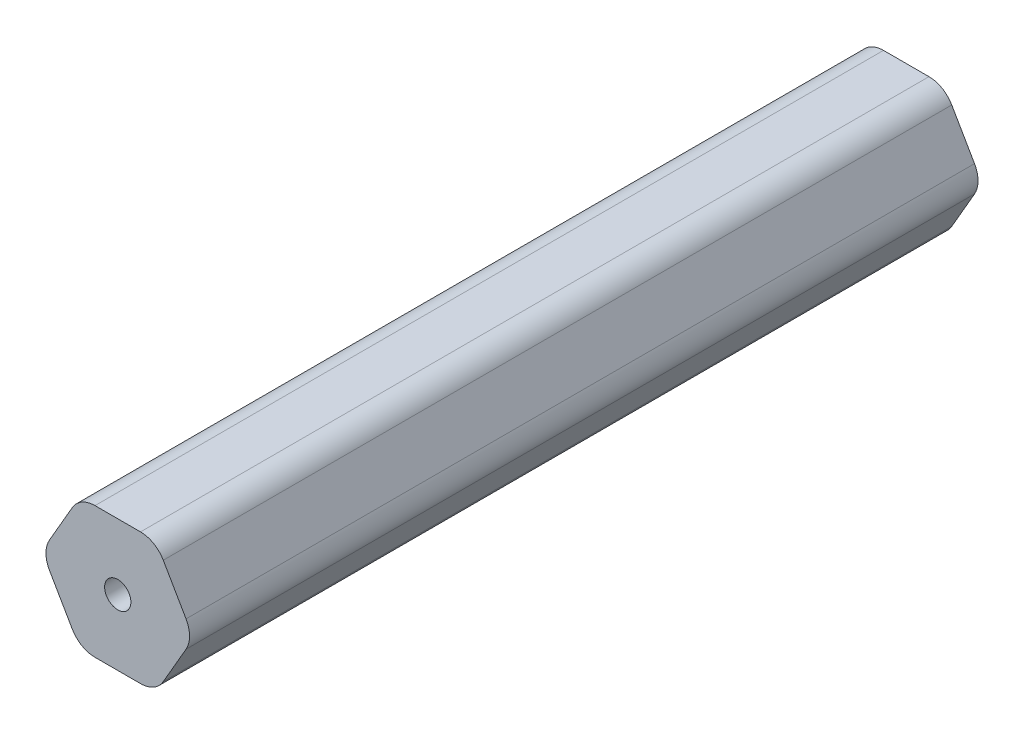
ISO-10303-21;
HEADER;
FILE_DESCRIPTION(('STEP AP214'),'2;1');
FILE_NAME('part.step','',(''),(''),'','','');
FILE_SCHEMA(('AUTOMOTIVE_DESIGN { 1 0 10303 214 1 1 1 1 }'));
ENDSEC;
DATA;
#1=APPLICATION_CONTEXT('core data for automotive mechanical design processes');
#2=APPLICATION_PROTOCOL_DEFINITION('international standard','automotive_design',2000,#1);
#3=PRODUCT_CONTEXT('',#1,'mechanical');
#4=PRODUCT('Part','Part','',(#3));
#5=PRODUCT_RELATED_PRODUCT_CATEGORY('part','',(#4));
#6=PRODUCT_DEFINITION_FORMATION('','',#4);
#7=PRODUCT_DEFINITION_CONTEXT('part definition',#1,'design');
#8=PRODUCT_DEFINITION('design','',#6,#7);
#9=PRODUCT_DEFINITION_SHAPE('','',#8);
#10=(LENGTH_UNIT() NAMED_UNIT(*) SI_UNIT(.MILLI.,.METRE.));
#11=(NAMED_UNIT(*) PLANE_ANGLE_UNIT() SI_UNIT($,.RADIAN.));
#12=(NAMED_UNIT(*) SI_UNIT($,.STERADIAN.) SOLID_ANGLE_UNIT());
#13=UNCERTAINTY_MEASURE_WITH_UNIT(LENGTH_MEASURE(1.E-05),#10,'distance_accuracy_value','');
#14=(GEOMETRIC_REPRESENTATION_CONTEXT(3) GLOBAL_UNCERTAINTY_ASSIGNED_CONTEXT((#13)) GLOBAL_UNIT_ASSIGNED_CONTEXT((#10,
#11,#12)) REPRESENTATION_CONTEXT('',''));
#15=CARTESIAN_POINT('',(0.,0.,0.));
#16=DIRECTION('',(0.,0.,1.));
#17=DIRECTION('',(1.,0.,0.));
#18=AXIS2_PLACEMENT_3D('',#15,#16,#17);
#19=CARTESIAN_POINT('',(0.,0.,76.2));
#20=DIRECTION('',(0.,0.,1.));
#21=DIRECTION('',(1.,0.,0.));
#22=AXIS2_PLACEMENT_3D('',#19,#20,#21);
#23=PLANE('',#22);
#24=DIRECTION('',(0.500000000000007,-0.866025403784434,0.));
#25=VECTOR('',#24,1.);
#26=CARTESIAN_POINT('',(-13.8020676116861,-0.934514994541311,76.2));
#27=LINE('',#26,#25);
#28=CARTESIAN_POINT('',(-13.0688327698153,-2.20451499454131,76.2));
#29=VERTEX_POINT('',#28);
#30=CARTESIAN_POINT('',(-10.8691282442028,-6.0145149945413,76.2));
#31=VERTEX_POINT('',#30);
#32=EDGE_CURVE('E262',#29,#31,#27,.T.);
#33=ORIENTED_EDGE('',*,*,#32,.T.);
#34=CARTESIAN_POINT('',(-8.6694237185903,-4.74451499454128,76.2));
#35=DIRECTION('',(0.,0.,1.));
#36=DIRECTION('',(1.,0.,0.));
#37=AXIS2_PLACEMENT_3D('',#34,#35,#36);
#38=CIRCLE('',#37,2.54);
#39=CARTESIAN_POINT('',(-8.66942371859028,-7.28451499454128,76.2));
#40=VERTEX_POINT('',#39);
#41=EDGE_CURVE('E210',#31,#40,#38,.T.);
#42=ORIENTED_EDGE('',*,*,#41,.T.);
#43=DIRECTION('',(1.,0.,0.));
#44=VECTOR('',#43,1.);
#45=CARTESIAN_POINT('',(-10.1358934023319,-7.2845149945413,76.2));
#46=LINE('',#45,#44);
#47=CARTESIAN_POINT('',(-4.2700146673653,-7.28451499454124,76.2));
#48=VERTEX_POINT('',#47);
#49=EDGE_CURVE('E155',#40,#48,#46,.T.);
#50=ORIENTED_EDGE('',*,*,#49,.T.);
#51=CARTESIAN_POINT('',(-4.27001466736533,-4.74451499454124,76.2));
#52=DIRECTION('',(0.,0.,1.));
#53=DIRECTION('',(1.,0.,0.));
#54=AXIS2_PLACEMENT_3D('',#51,#52,#53);
#55=CIRCLE('',#54,2.54);
#56=CARTESIAN_POINT('',(-2.07031014175285,-6.01451499454122,76.2));
#57=VERTEX_POINT('',#56);
#58=EDGE_CURVE('E207',#48,#57,#55,.T.);
#59=ORIENTED_EDGE('',*,*,#58,.T.);
#60=DIRECTION('',(0.499999999999995,0.866025403784441,0.));
#61=VECTOR('',#60,1.);
#62=CARTESIAN_POINT('',(-2.80354498362366,-7.28451499454122,76.2));
#63=LINE('',#62,#61);
#64=CARTESIAN_POINT('',(0.129394383859577,-2.20451499454126,76.2));
#65=VERTEX_POINT('',#64);
#66=EDGE_CURVE('E164',#57,#65,#63,.T.);
#67=ORIENTED_EDGE('',*,*,#66,.T.);
#68=CARTESIAN_POINT('',(-2.0703101417529,-0.934514994541271,76.2));
#69=DIRECTION('',(0.,0.,1.));
#70=DIRECTION('',(1.,0.,0.));
#71=AXIS2_PLACEMENT_3D('',#68,#69,#70);
#72=CIRCLE('',#71,2.54);
#73=CARTESIAN_POINT('',(0.129394383859569,0.335485005458732,76.2));
#74=VERTEX_POINT('',#73);
#75=EDGE_CURVE('E204',#65,#74,#72,.T.);
#76=ORIENTED_EDGE('',*,*,#75,.T.);
#77=DIRECTION('',(-0.500000000000001,0.866025403784438,0.));
#78=VECTOR('',#77,1.);
#79=CARTESIAN_POINT('',(0.862629225730391,-0.93451499454126,76.2));
#80=LINE('',#79,#78);
#81=CARTESIAN_POINT('',(-2.07031014175292,4.14548500545875,76.2));
#82=VERTEX_POINT('',#81);
#83=EDGE_CURVE('E170',#74,#82,#80,.T.);
#84=ORIENTED_EDGE('',*,*,#83,.T.);
#85=CARTESIAN_POINT('',(-4.27001466736539,2.87548500545875,76.2));
#86=DIRECTION('',(0.,0.,1.));
#87=DIRECTION('',(1.,0.,0.));
#88=AXIS2_PLACEMENT_3D('',#85,#86,#87);
#89=CIRCLE('',#88,2.54);
#90=CARTESIAN_POINT('',(-4.2700146673654,5.41548500545875,76.2));
#91=VERTEX_POINT('',#90);
#92=EDGE_CURVE('E196',#82,#91,#89,.T.);
#93=ORIENTED_EDGE('',*,*,#92,.T.);
#94=DIRECTION('',(-1.,0.,0.));
#95=VECTOR('',#94,1.);
#96=CARTESIAN_POINT('',(-2.80354498362375,5.41548500545875,76.2));
#97=LINE('',#96,#95);
#98=CARTESIAN_POINT('',(-8.66942371859036,5.41548500545873,76.2));
#99=VERTEX_POINT('',#98);
#100=EDGE_CURVE('E242',#91,#99,#97,.T.);
#101=ORIENTED_EDGE('',*,*,#100,.T.);
#102=CARTESIAN_POINT('',(-8.66942371859035,2.87548500545873,76.2));
#103=DIRECTION('',(0.,0.,1.));
#104=DIRECTION('',(1.,0.,0.));
#105=AXIS2_PLACEMENT_3D('',#102,#103,#104);
#106=CIRCLE('',#105,2.54);
#107=CARTESIAN_POINT('',(-10.8691282442028,4.14548500545872,76.2));
#108=VERTEX_POINT('',#107);
#109=EDGE_CURVE('E66',#99,#108,#106,.T.);
#110=ORIENTED_EDGE('',*,*,#109,.T.);
#111=DIRECTION('',(-0.499999999999995,-0.866025403784441,0.));
#112=VECTOR('',#111,1.);
#113=CARTESIAN_POINT('',(-10.135893402332,5.41548500545873,76.2));
#114=LINE('',#113,#112);
#115=CARTESIAN_POINT('',(-13.0688327698153,0.335485005458698,76.2));
#116=VERTEX_POINT('',#115);
#117=EDGE_CURVE('E266',#108,#116,#114,.T.);
#118=ORIENTED_EDGE('',*,*,#117,.T.);
#119=CARTESIAN_POINT('',(-10.8691282442028,-0.93451499454129,76.2));
#120=DIRECTION('',(0.,0.,1.));
#121=DIRECTION('',(1.,0.,0.));
#122=AXIS2_PLACEMENT_3D('',#119,#120,#121);
#123=CIRCLE('',#122,2.54);
#124=EDGE_CURVE('E201',#116,#29,#123,.T.);
#125=ORIENTED_EDGE('',*,*,#124,.T.);
#126=EDGE_LOOP('',(#33,#42,#50,#59,#67,#76,#84,#93,#101,#110,#118,#125));
#127=FACE_BOUND('',#126,.T.);
#128=CARTESIAN_POINT('',(-6.46971919297786,-0.93451499454126,76.2));
#129=DIRECTION('',(0.,0.,1.));
#130=DIRECTION('',(1.,0.,0.));
#131=AXIS2_PLACEMENT_3D('',#128,#129,#130);
#132=CIRCLE('',#131,1.27);
#133=CARTESIAN_POINT('',(-7.73971919297786,-0.93451499454126,76.2));
#134=VERTEX_POINT('',#133);
#135=EDGE_CURVE('E259',#134,#134,#132,.T.);
#136=ORIENTED_EDGE('',*,*,#135,.F.);
#137=EDGE_LOOP('',(#136));
#138=FACE_BOUND('',#137,.T.);
#139=ADVANCED_FACE('F43',(#127,#138),#23,.T.);
#140=CARTESIAN_POINT('',(0.,0.,0.));
#141=DIRECTION('',(0.,0.,1.));
#142=DIRECTION('',(1.,0.,0.));
#143=AXIS2_PLACEMENT_3D('',#140,#141,#142);
#144=PLANE('',#143);
#145=DIRECTION('',(1.,0.,0.));
#146=VECTOR('',#145,1.);
#147=CARTESIAN_POINT('',(-10.1358934023319,-7.2845149945413,0.));
#148=LINE('',#147,#146);
#149=CARTESIAN_POINT('',(-8.66942371859028,-7.28451499454128,0.));
#150=VERTEX_POINT('',#149);
#151=CARTESIAN_POINT('',(-4.2700146673653,-7.28451499454124,0.));
#152=VERTEX_POINT('',#151);
#153=EDGE_CURVE('E152',#150,#152,#148,.T.);
#154=ORIENTED_EDGE('',*,*,#153,.F.);
#155=CARTESIAN_POINT('',(-8.6694237185903,-4.74451499454128,0.));
#156=DIRECTION('',(0.,0.,1.));
#157=DIRECTION('',(1.,0.,0.));
#158=AXIS2_PLACEMENT_3D('',#155,#156,#157);
#159=CIRCLE('',#158,2.54);
#160=CARTESIAN_POINT('',(-10.8691282442028,-6.0145149945413,0.));
#161=VERTEX_POINT('',#160);
#162=EDGE_CURVE('E134',#150,#161,#159,.F.);
#163=ORIENTED_EDGE('',*,*,#162,.T.);
#164=DIRECTION('',(0.500000000000007,-0.866025403784434,0.));
#165=VECTOR('',#164,1.);
#166=CARTESIAN_POINT('',(-13.8020676116861,-0.934514994541311,0.));
#167=LINE('',#166,#165);
#168=CARTESIAN_POINT('',(-13.0688327698153,-2.20451499454131,0.));
#169=VERTEX_POINT('',#168);
#170=EDGE_CURVE('E165',#169,#161,#167,.T.);
#171=ORIENTED_EDGE('',*,*,#170,.F.);
#172=CARTESIAN_POINT('',(-10.8691282442028,-0.93451499454129,0.));
#173=DIRECTION('',(0.,0.,1.));
#174=DIRECTION('',(1.,0.,0.));
#175=AXIS2_PLACEMENT_3D('',#172,#173,#174);
#176=CIRCLE('',#175,2.54);
#177=CARTESIAN_POINT('',(-13.0688327698153,0.335485005458698,0.));
#178=VERTEX_POINT('',#177);
#179=EDGE_CURVE('E183',#169,#178,#176,.F.);
#180=ORIENTED_EDGE('',*,*,#179,.T.);
#181=DIRECTION('',(-0.499999999999995,-0.866025403784441,0.));
#182=VECTOR('',#181,1.);
#183=CARTESIAN_POINT('',(-10.135893402332,5.41548500545873,0.));
#184=LINE('',#183,#182);
#185=CARTESIAN_POINT('',(-10.8691282442028,4.14548500545872,0.));
#186=VERTEX_POINT('',#185);
#187=EDGE_CURVE('E172',#186,#178,#184,.T.);
#188=ORIENTED_EDGE('',*,*,#187,.F.);
#189=CARTESIAN_POINT('',(-8.66942371859035,2.87548500545873,0.));
#190=DIRECTION('',(0.,0.,1.));
#191=DIRECTION('',(1.,0.,0.));
#192=AXIS2_PLACEMENT_3D('',#189,#190,#191);
#193=CIRCLE('',#192,2.54);
#194=CARTESIAN_POINT('',(-8.66942371859036,5.41548500545873,0.));
#195=VERTEX_POINT('',#194);
#196=EDGE_CURVE('E180',#186,#195,#193,.F.);
#197=ORIENTED_EDGE('',*,*,#196,.T.);
#198=DIRECTION('',(-1.,0.,0.));
#199=VECTOR('',#198,1.);
#200=CARTESIAN_POINT('',(-2.80354498362375,5.41548500545875,0.));
#201=LINE('',#200,#199);
#202=CARTESIAN_POINT('',(-4.2700146673654,5.41548500545875,0.));
#203=VERTEX_POINT('',#202);
#204=EDGE_CURVE('E240',#203,#195,#201,.T.);
#205=ORIENTED_EDGE('',*,*,#204,.F.);
#206=CARTESIAN_POINT('',(-4.27001466736539,2.87548500545875,0.));
#207=DIRECTION('',(0.,0.,1.));
#208=DIRECTION('',(1.,0.,0.));
#209=AXIS2_PLACEMENT_3D('',#206,#207,#208);
#210=CIRCLE('',#209,2.54);
#211=CARTESIAN_POINT('',(-2.07031014175292,4.14548500545875,0.));
#212=VERTEX_POINT('',#211);
#213=EDGE_CURVE('E157',#203,#212,#210,.F.);
#214=ORIENTED_EDGE('',*,*,#213,.T.);
#215=DIRECTION('',(-0.500000000000001,0.866025403784438,0.));
#216=VECTOR('',#215,1.);
#217=CARTESIAN_POINT('',(0.862629225730391,-0.93451499454126,0.));
#218=LINE('',#217,#216);
#219=CARTESIAN_POINT('',(0.129394383859569,0.335485005458732,0.));
#220=VERTEX_POINT('',#219);
#221=EDGE_CURVE('E249',#220,#212,#218,.T.);
#222=ORIENTED_EDGE('',*,*,#221,.F.);
#223=CARTESIAN_POINT('',(-2.0703101417529,-0.934514994541271,0.));
#224=DIRECTION('',(0.,0.,1.));
#225=DIRECTION('',(1.,0.,0.));
#226=AXIS2_PLACEMENT_3D('',#223,#224,#225);
#227=CIRCLE('',#226,2.54);
#228=CARTESIAN_POINT('',(0.129394383859577,-2.20451499454126,0.));
#229=VERTEX_POINT('',#228);
#230=EDGE_CURVE('E186',#220,#229,#227,.F.);
#231=ORIENTED_EDGE('',*,*,#230,.T.);
#232=DIRECTION('',(0.499999999999995,0.866025403784441,0.));
#233=VECTOR('',#232,1.);
#234=CARTESIAN_POINT('',(-2.80354498362366,-7.28451499454122,0.));
#235=LINE('',#234,#233);
#236=CARTESIAN_POINT('',(-2.07031014175285,-6.01451499454122,0.));
#237=VERTEX_POINT('',#236);
#238=EDGE_CURVE('E253',#237,#229,#235,.T.);
#239=ORIENTED_EDGE('',*,*,#238,.F.);
#240=CARTESIAN_POINT('',(-4.27001466736533,-4.74451499454124,0.));
#241=DIRECTION('',(0.,0.,1.));
#242=DIRECTION('',(1.,0.,0.));
#243=AXIS2_PLACEMENT_3D('',#240,#241,#242);
#244=CIRCLE('',#243,2.54);
#245=EDGE_CURVE('E146',#237,#152,#244,.F.);
#246=ORIENTED_EDGE('',*,*,#245,.T.);
#247=EDGE_LOOP('',(#154,#163,#171,#180,#188,#197,#205,#214,#222,#231,#239,#246));
#248=FACE_BOUND('',#247,.T.);
#249=CARTESIAN_POINT('',(-6.46971919297786,-0.93451499454126,0.));
#250=DIRECTION('',(0.,0.,1.));
#251=DIRECTION('',(1.,0.,0.));
#252=AXIS2_PLACEMENT_3D('',#249,#250,#251);
#253=CIRCLE('',#252,1.27);
#254=CARTESIAN_POINT('',(-7.73971919297786,-0.93451499454126,0.));
#255=VERTEX_POINT('',#254);
#256=EDGE_CURVE('E274',#255,#255,#253,.T.);
#257=ORIENTED_EDGE('',*,*,#256,.T.);
#258=EDGE_LOOP('',(#257));
#259=FACE_BOUND('',#258,.T.);
#260=ADVANCED_FACE('F160',(#248,#259),#144,.F.);
#261=CARTESIAN_POINT('',(-2.80354498362366,-7.28451499454122,76.2));
#262=DIRECTION('',(-0.866025403784442,0.499999999999995,0.));
#263=DIRECTION('',(-0.499999999999995,-0.866025403784442,0.));
#264=AXIS2_PLACEMENT_3D('',#261,#262,#263);
#265=PLANE('',#264);
#266=ORIENTED_EDGE('',*,*,#66,.F.);
#267=DIRECTION('',(0.,0.,-1.));
#268=VECTOR('',#267,1.);
#269=CARTESIAN_POINT('',(-2.07031014175285,-6.01451499454122,76.2));
#270=LINE('',#269,#268);
#271=EDGE_CURVE('E216',#57,#237,#270,.T.);
#272=ORIENTED_EDGE('',*,*,#271,.T.);
#273=ORIENTED_EDGE('',*,*,#238,.T.);
#274=DIRECTION('',(0.,0.,-1.));
#275=VECTOR('',#274,1.);
#276=CARTESIAN_POINT('',(0.129394383859577,-2.20451499454126,76.2));
#277=LINE('',#276,#275);
#278=EDGE_CURVE('E213',#229,#65,#277,.F.);
#279=ORIENTED_EDGE('',*,*,#278,.T.);
#280=EDGE_LOOP('',(#266,#272,#273,#279));
#281=FACE_BOUND('',#280,.T.);
#282=ADVANCED_FACE('F290',(#281),#265,.F.);
#283=CARTESIAN_POINT('',(0.862629225730391,-0.93451499454126,76.2));
#284=DIRECTION('',(-0.866025403784438,-0.500000000000001,0.));
#285=DIRECTION('',(0.500000000000001,-0.866025403784438,0.));
#286=AXIS2_PLACEMENT_3D('',#283,#284,#285);
#287=PLANE('',#286);
#288=ORIENTED_EDGE('',*,*,#83,.F.);
#289=DIRECTION('',(0.,0.,-1.));
#290=VECTOR('',#289,1.);
#291=CARTESIAN_POINT('',(0.129394383859569,0.335485005458732,76.2));
#292=LINE('',#291,#290);
#293=EDGE_CURVE('E223',#74,#220,#292,.T.);
#294=ORIENTED_EDGE('',*,*,#293,.T.);
#295=ORIENTED_EDGE('',*,*,#221,.T.);
#296=DIRECTION('',(0.,0.,-1.));
#297=VECTOR('',#296,1.);
#298=CARTESIAN_POINT('',(-2.07031014175292,4.14548500545875,76.2));
#299=LINE('',#298,#297);
#300=EDGE_CURVE('E220',#212,#82,#299,.F.);
#301=ORIENTED_EDGE('',*,*,#300,.T.);
#302=EDGE_LOOP('',(#288,#294,#295,#301));
#303=FACE_BOUND('',#302,.T.);
#304=ADVANCED_FACE('F305',(#303),#287,.F.);
#305=CARTESIAN_POINT('',(-2.80354498362375,5.41548500545875,76.2));
#306=DIRECTION('',(0.,-1.,0.));
#307=DIRECTION('',(1.,0.,0.));
#308=AXIS2_PLACEMENT_3D('',#305,#306,#307);
#309=PLANE('',#308);
#310=ORIENTED_EDGE('',*,*,#204,.T.);
#311=DIRECTION('',(0.,0.,-1.));
#312=VECTOR('',#311,1.);
#313=CARTESIAN_POINT('',(-8.66942371859036,5.41548500545873,76.2));
#314=LINE('',#313,#312);
#315=EDGE_CURVE('E11',#195,#99,#314,.F.);
#316=ORIENTED_EDGE('',*,*,#315,.T.);
#317=ORIENTED_EDGE('',*,*,#100,.F.);
#318=DIRECTION('',(0.,0.,-1.));
#319=VECTOR('',#318,1.);
#320=CARTESIAN_POINT('',(-4.2700146673654,5.41548500545875,76.2));
#321=LINE('',#320,#319);
#322=EDGE_CURVE('E52',#91,#203,#321,.T.);
#323=ORIENTED_EDGE('',*,*,#322,.T.);
#324=EDGE_LOOP('',(#310,#316,#317,#323));
#325=FACE_BOUND('',#324,.T.);
#326=ADVANCED_FACE('F239',(#325),#309,.F.);
#327=CARTESIAN_POINT('',(-10.135893402332,5.41548500545873,76.2));
#328=DIRECTION('',(0.866025403784442,-0.499999999999995,0.));
#329=DIRECTION('',(0.499999999999995,0.866025403784442,0.));
#330=AXIS2_PLACEMENT_3D('',#327,#328,#329);
#331=PLANE('',#330);
#332=ORIENTED_EDGE('',*,*,#187,.T.);
#333=DIRECTION('',(0.,0.,-1.));
#334=VECTOR('',#333,1.);
#335=CARTESIAN_POINT('',(-13.0688327698153,0.335485005458698,76.2));
#336=LINE('',#335,#334);
#337=EDGE_CURVE('E59',#178,#116,#336,.F.);
#338=ORIENTED_EDGE('',*,*,#337,.T.);
#339=ORIENTED_EDGE('',*,*,#117,.F.);
#340=DIRECTION('',(0.,0.,-1.));
#341=VECTOR('',#340,1.);
#342=CARTESIAN_POINT('',(-10.8691282442028,4.14548500545872,76.2));
#343=LINE('',#342,#341);
#344=EDGE_CURVE('E227',#108,#186,#343,.T.);
#345=ORIENTED_EDGE('',*,*,#344,.T.);
#346=EDGE_LOOP('',(#332,#338,#339,#345));
#347=FACE_BOUND('',#346,.T.);
#348=ADVANCED_FACE('F299',(#347),#331,.F.);
#349=CARTESIAN_POINT('',(-13.8020676116861,-0.934514994541311,76.2));
#350=DIRECTION('',(0.866025403784434,0.500000000000007,0.));
#351=DIRECTION('',(-0.500000000000007,0.866025403784434,0.));
#352=AXIS2_PLACEMENT_3D('',#349,#350,#351);
#353=PLANE('',#352);
#354=ORIENTED_EDGE('',*,*,#170,.T.);
#355=DIRECTION('',(0.,0.,-1.));
#356=VECTOR('',#355,1.);
#357=CARTESIAN_POINT('',(-10.8691282442028,-6.0145149945413,76.2));
#358=LINE('',#357,#356);
#359=EDGE_CURVE('E139',#161,#31,#358,.F.);
#360=ORIENTED_EDGE('',*,*,#359,.T.);
#361=ORIENTED_EDGE('',*,*,#32,.F.);
#362=DIRECTION('',(0.,0.,-1.));
#363=VECTOR('',#362,1.);
#364=CARTESIAN_POINT('',(-13.0688327698153,-2.20451499454131,76.2));
#365=LINE('',#364,#363);
#366=EDGE_CURVE('E145',#29,#169,#365,.T.);
#367=ORIENTED_EDGE('',*,*,#366,.T.);
#368=EDGE_LOOP('',(#354,#360,#361,#367));
#369=FACE_BOUND('',#368,.T.);
#370=ADVANCED_FACE('F296',(#369),#353,.F.);
#371=CARTESIAN_POINT('',(-10.1358934023319,-7.2845149945413,76.2));
#372=DIRECTION('',(0.,1.,0.));
#373=DIRECTION('',(-1.,0.,0.));
#374=AXIS2_PLACEMENT_3D('',#371,#372,#373);
#375=PLANE('',#374);
#376=ORIENTED_EDGE('',*,*,#49,.F.);
#377=DIRECTION('',(0.,0.,-1.));
#378=VECTOR('',#377,1.);
#379=CARTESIAN_POINT('',(-8.66942371859028,-7.28451499454128,76.2));
#380=LINE('',#379,#378);
#381=EDGE_CURVE('E138',#40,#150,#380,.T.);
#382=ORIENTED_EDGE('',*,*,#381,.T.);
#383=ORIENTED_EDGE('',*,*,#153,.T.);
#384=DIRECTION('',(0.,0.,-1.));
#385=VECTOR('',#384,1.);
#386=CARTESIAN_POINT('',(-4.2700146673653,-7.28451499454124,76.2));
#387=LINE('',#386,#385);
#388=EDGE_CURVE('E158',#152,#48,#387,.F.);
#389=ORIENTED_EDGE('',*,*,#388,.T.);
#390=EDGE_LOOP('',(#376,#382,#383,#389));
#391=FACE_BOUND('',#390,.T.);
#392=ADVANCED_FACE('F151',(#391),#375,.F.);
#393=CARTESIAN_POINT('',(-6.46971919297786,-0.93451499454126,76.2));
#394=DIRECTION('',(0.,0.,-1.));
#395=DIRECTION('',(-1.,0.,0.));
#396=AXIS2_PLACEMENT_3D('',#393,#394,#395);
#397=CYLINDRICAL_SURFACE('',#396,1.27);
#398=CARTESIAN_POINT('',(-7.73971919297786,-0.93451499454126,76.2));
#399=CARTESIAN_POINT('',(-7.73971919297786,-0.93451499454126,75.40625));
#400=CARTESIAN_POINT('',(-7.73971919297786,-0.93451499454126,74.6125));
#401=CARTESIAN_POINT('',(-7.73971919297786,-0.93451499454126,73.025));
#402=CARTESIAN_POINT('',(-7.73971919297786,-0.93451499454126,72.23125));
#403=CARTESIAN_POINT('',(-7.73971919297786,-0.93451499454126,70.64375));
#404=CARTESIAN_POINT('',(-7.73971919297786,-0.93451499454126,69.85));
#405=CARTESIAN_POINT('',(-7.73971919297786,-0.93451499454126,68.2625));
#406=CARTESIAN_POINT('',(-7.73971919297786,-0.93451499454126,67.46875));
#407=CARTESIAN_POINT('',(-7.73971919297786,-0.93451499454126,65.88125));
#408=CARTESIAN_POINT('',(-7.73971919297786,-0.93451499454126,65.0875));
#409=CARTESIAN_POINT('',(-7.73971919297786,-0.93451499454126,63.5));
#410=CARTESIAN_POINT('',(-7.73971919297786,-0.93451499454126,62.70625));
#411=CARTESIAN_POINT('',(-7.73971919297786,-0.93451499454126,61.11875));
#412=CARTESIAN_POINT('',(-7.73971919297786,-0.93451499454126,60.325));
#413=CARTESIAN_POINT('',(-7.73971919297786,-0.93451499454126,58.7375));
#414=CARTESIAN_POINT('',(-7.73971919297786,-0.93451499454126,57.94375));
#415=CARTESIAN_POINT('',(-7.73971919297786,-0.93451499454126,56.35625));
#416=CARTESIAN_POINT('',(-7.73971919297786,-0.93451499454126,55.5625));
#417=CARTESIAN_POINT('',(-7.73971919297786,-0.93451499454126,53.975));
#418=CARTESIAN_POINT('',(-7.73971919297786,-0.93451499454126,53.18125));
#419=CARTESIAN_POINT('',(-7.73971919297786,-0.93451499454126,51.59375));
#420=CARTESIAN_POINT('',(-7.73971919297786,-0.93451499454126,50.8));
#421=CARTESIAN_POINT('',(-7.73971919297786,-0.93451499454126,49.2125));
#422=CARTESIAN_POINT('',(-7.73971919297786,-0.93451499454126,48.41875));
#423=CARTESIAN_POINT('',(-7.73971919297786,-0.93451499454126,46.83125));
#424=CARTESIAN_POINT('',(-7.73971919297786,-0.93451499454126,46.0375));
#425=CARTESIAN_POINT('',(-7.73971919297786,-0.93451499454126,44.45));
#426=CARTESIAN_POINT('',(-7.73971919297786,-0.93451499454126,43.65625));
#427=CARTESIAN_POINT('',(-7.73971919297786,-0.93451499454126,42.06875));
#428=CARTESIAN_POINT('',(-7.73971919297786,-0.93451499454126,41.275));
#429=CARTESIAN_POINT('',(-7.73971919297786,-0.93451499454126,39.6875));
#430=CARTESIAN_POINT('',(-7.73971919297786,-0.93451499454126,38.89375));
#431=CARTESIAN_POINT('',(-7.73971919297786,-0.93451499454126,37.30625));
#432=CARTESIAN_POINT('',(-7.73971919297786,-0.93451499454126,36.5125));
#433=CARTESIAN_POINT('',(-7.73971919297786,-0.93451499454126,34.925));
#434=CARTESIAN_POINT('',(-7.73971919297786,-0.93451499454126,34.13125));
#435=CARTESIAN_POINT('',(-7.73971919297786,-0.93451499454126,32.54375));
#436=CARTESIAN_POINT('',(-7.73971919297786,-0.93451499454126,31.75));
#437=CARTESIAN_POINT('',(-7.73971919297786,-0.93451499454126,30.1625));
#438=CARTESIAN_POINT('',(-7.73971919297786,-0.93451499454126,29.36875));
#439=CARTESIAN_POINT('',(-7.73971919297786,-0.93451499454126,27.78125));
#440=CARTESIAN_POINT('',(-7.73971919297786,-0.93451499454126,26.9875));
#441=CARTESIAN_POINT('',(-7.73971919297786,-0.93451499454126,25.4));
#442=CARTESIAN_POINT('',(-7.73971919297786,-0.93451499454126,24.60625));
#443=CARTESIAN_POINT('',(-7.73971919297786,-0.93451499454126,23.01875));
#444=CARTESIAN_POINT('',(-7.73971919297786,-0.93451499454126,22.225));
#445=CARTESIAN_POINT('',(-7.73971919297786,-0.93451499454126,20.6375));
#446=CARTESIAN_POINT('',(-7.73971919297786,-0.93451499454126,19.84375));
#447=CARTESIAN_POINT('',(-7.73971919297786,-0.93451499454126,18.25625));
#448=CARTESIAN_POINT('',(-7.73971919297786,-0.93451499454126,17.4625));
#449=CARTESIAN_POINT('',(-7.73971919297786,-0.93451499454126,15.875));
#450=CARTESIAN_POINT('',(-7.73971919297786,-0.93451499454126,15.08125));
#451=CARTESIAN_POINT('',(-7.73971919297786,-0.93451499454126,13.49375));
#452=CARTESIAN_POINT('',(-7.73971919297786,-0.93451499454126,12.7));
#453=CARTESIAN_POINT('',(-7.73971919297786,-0.93451499454126,11.1125));
#454=CARTESIAN_POINT('',(-7.73971919297786,-0.93451499454126,10.31875));
#455=CARTESIAN_POINT('',(-7.73971919297786,-0.93451499454126,8.73125));
#456=CARTESIAN_POINT('',(-7.73971919297786,-0.93451499454126,7.93750000000001));
#457=CARTESIAN_POINT('',(-7.73971919297786,-0.93451499454126,6.35));
#458=CARTESIAN_POINT('',(-7.73971919297786,-0.93451499454126,5.55625));
#459=CARTESIAN_POINT('',(-7.73971919297786,-0.93451499454126,3.96875));
#460=CARTESIAN_POINT('',(-7.73971919297786,-0.93451499454126,3.175));
#461=CARTESIAN_POINT('',(-7.73971919297786,-0.93451499454126,1.5875));
#462=CARTESIAN_POINT('',(-7.73971919297786,-0.93451499454126,0.793750000000001));
#463=CARTESIAN_POINT('',(-7.73971919297786,-0.93451499454126,0.));
#464=B_SPLINE_CURVE_WITH_KNOTS('',3,(#398,#399,#400,#401,#402,#403,#404,#405,#406,#407,#408,
#409,#410,#411,#412,#413,#414,#415,#416,#417,#418,#419,#420,#421,#422,#423,#424,#425,#426,#427,
#428,#429,#430,#431,#432,#433,#434,#435,#436,#437,#438,#439,#440,#441,#442,#443,#444,#445,#446,
#447,#448,#449,#450,#451,#452,#453,#454,#455,#456,#457,#458,#459,#460,#461,#462,#463),
.UNSPECIFIED.,.F.,.F.,(4,2,2,2,2,2,2,2,2,2,2,2,2,2,2,2,2,2,2,2,2,2,2,2,2,2,2,2,2,2,2,2,4),(0.,
2.38124999999999,4.76249999999999,7.14374999999999,9.52499999999999,11.90625,14.2875,16.66875,
19.05,21.43125,23.8125,26.19375,28.575,30.95625,33.3375,35.71875,38.1,40.48125,42.8625,45.24375,
47.625,50.00625,52.3875,54.76875,57.15,59.53125,61.9125,64.29375,66.675,69.05625,71.4375,
73.81875,76.2),.UNSPECIFIED.);
#465=EDGE_CURVE('BSEAM282',#134,#255,#464,.T.);
#466=ORIENTED_EDGE('',*,*,#135,.T.);
#467=ORIENTED_EDGE('',*,*,#256,.F.);
#468=ORIENTED_EDGE('',*,*,#465,.T.);
#469=ORIENTED_EDGE('',*,*,#465,.F.);
#470=EDGE_LOOP('',(#466,#468,#467,#469));
#471=FACE_BOUND('',#470,.T.);
#472=ADVANCED_FACE('F282',(#471),#397,.F.);
#473=CARTESIAN_POINT('',(-8.6694237185903,-4.74451499454128,76.2));
#474=DIRECTION('',(0.,0.,-1.));
#475=DIRECTION('',(-1.,0.,0.));
#476=AXIS2_PLACEMENT_3D('',#473,#474,#475);
#477=CYLINDRICAL_SURFACE('',#476,2.54);
#478=ORIENTED_EDGE('',*,*,#41,.F.);
#479=ORIENTED_EDGE('',*,*,#359,.F.);
#480=ORIENTED_EDGE('',*,*,#162,.F.);
#481=ORIENTED_EDGE('',*,*,#381,.F.);
#482=EDGE_LOOP('',(#478,#479,#480,#481));
#483=FACE_BOUND('',#482,.T.);
#484=ADVANCED_FACE('F137',(#483),#477,.T.);
#485=CARTESIAN_POINT('',(-4.27001466736533,-4.74451499454124,76.2));
#486=DIRECTION('',(0.,0.,-1.));
#487=DIRECTION('',(-1.,0.,0.));
#488=AXIS2_PLACEMENT_3D('',#485,#486,#487);
#489=CYLINDRICAL_SURFACE('',#488,2.54);
#490=ORIENTED_EDGE('',*,*,#58,.F.);
#491=ORIENTED_EDGE('',*,*,#388,.F.);
#492=ORIENTED_EDGE('',*,*,#245,.F.);
#493=ORIENTED_EDGE('',*,*,#271,.F.);
#494=EDGE_LOOP('',(#490,#491,#492,#493));
#495=FACE_BOUND('',#494,.T.);
#496=ADVANCED_FACE('F314',(#495),#489,.T.);
#497=CARTESIAN_POINT('',(-2.0703101417529,-0.934514994541271,76.2));
#498=DIRECTION('',(0.,0.,-1.));
#499=DIRECTION('',(-1.,0.,0.));
#500=AXIS2_PLACEMENT_3D('',#497,#498,#499);
#501=CYLINDRICAL_SURFACE('',#500,2.54);
#502=ORIENTED_EDGE('',*,*,#75,.F.);
#503=ORIENTED_EDGE('',*,*,#278,.F.);
#504=ORIENTED_EDGE('',*,*,#230,.F.);
#505=ORIENTED_EDGE('',*,*,#293,.F.);
#506=EDGE_LOOP('',(#502,#503,#504,#505));
#507=FACE_BOUND('',#506,.T.);
#508=ADVANCED_FACE('F317',(#507),#501,.T.);
#509=CARTESIAN_POINT('',(-10.8691282442028,-0.93451499454129,76.2));
#510=DIRECTION('',(0.,0.,-1.));
#511=DIRECTION('',(-1.,0.,0.));
#512=AXIS2_PLACEMENT_3D('',#509,#510,#511);
#513=CYLINDRICAL_SURFACE('',#512,2.54);
#514=ORIENTED_EDGE('',*,*,#124,.F.);
#515=ORIENTED_EDGE('',*,*,#337,.F.);
#516=ORIENTED_EDGE('',*,*,#179,.F.);
#517=ORIENTED_EDGE('',*,*,#366,.F.);
#518=EDGE_LOOP('',(#514,#515,#516,#517));
#519=FACE_BOUND('',#518,.T.);
#520=ADVANCED_FACE('F321',(#519),#513,.T.);
#521=CARTESIAN_POINT('',(-8.66942371859035,2.87548500545873,76.2));
#522=DIRECTION('',(0.,0.,-1.));
#523=DIRECTION('',(-1.,0.,0.));
#524=AXIS2_PLACEMENT_3D('',#521,#522,#523);
#525=CYLINDRICAL_SURFACE('',#524,2.54);
#526=ORIENTED_EDGE('',*,*,#109,.F.);
#527=ORIENTED_EDGE('',*,*,#315,.F.);
#528=ORIENTED_EDGE('',*,*,#196,.F.);
#529=ORIENTED_EDGE('',*,*,#344,.F.);
#530=EDGE_LOOP('',(#526,#527,#528,#529));
#531=FACE_BOUND('',#530,.T.);
#532=ADVANCED_FACE('F324',(#531),#525,.T.);
#533=CARTESIAN_POINT('',(-4.27001466736539,2.87548500545875,76.2));
#534=DIRECTION('',(0.,0.,-1.));
#535=DIRECTION('',(-1.,0.,0.));
#536=AXIS2_PLACEMENT_3D('',#533,#534,#535);
#537=CYLINDRICAL_SURFACE('',#536,2.54);
#538=ORIENTED_EDGE('',*,*,#92,.F.);
#539=ORIENTED_EDGE('',*,*,#300,.F.);
#540=ORIENTED_EDGE('',*,*,#213,.F.);
#541=ORIENTED_EDGE('',*,*,#322,.F.);
#542=EDGE_LOOP('',(#538,#539,#540,#541));
#543=FACE_BOUND('',#542,.T.);
#544=ADVANCED_FACE('F45',(#543),#537,.T.);
#545=CLOSED_SHELL('',(#139,#260,#282,#304,#326,#348,#370,#392,#472,#484,#496,#508,#520,#532,#544));
#546=MANIFOLD_SOLID_BREP('B2',#545);
#547=ADVANCED_BREP_SHAPE_REPRESENTATION('',(#18,#546),#14);
#548=SHAPE_DEFINITION_REPRESENTATION(#9,#547);
ENDSEC;
END-ISO-10303-21;
